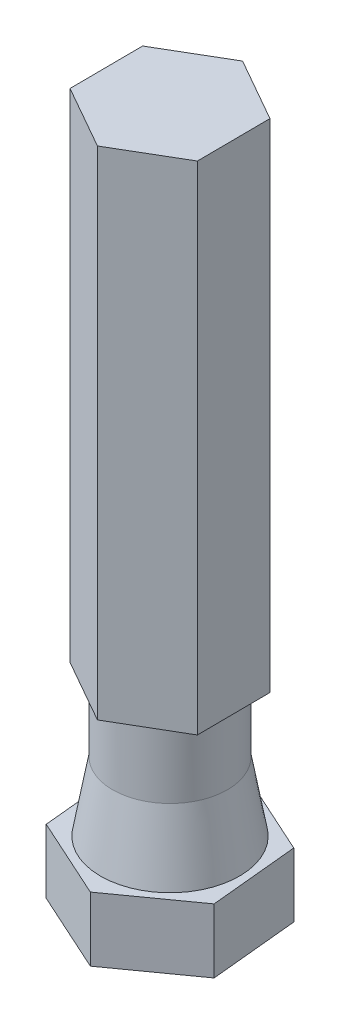
ISO-10303-21;
HEADER;
FILE_DESCRIPTION(('STEP AP214'),'2;1');
FILE_NAME('part.step','',(''),(''),'','','');
FILE_SCHEMA(('AUTOMOTIVE_DESIGN { 1 0 10303 214 1 1 1 1 }'));
ENDSEC;
DATA;
#1=APPLICATION_CONTEXT('core data for automotive mechanical design processes');
#2=APPLICATION_PROTOCOL_DEFINITION('international standard','automotive_design',2000,#1);
#3=PRODUCT_CONTEXT('',#1,'mechanical');
#4=PRODUCT('Part','Part','',(#3));
#5=PRODUCT_RELATED_PRODUCT_CATEGORY('part','',(#4));
#6=PRODUCT_DEFINITION_FORMATION('','',#4);
#7=PRODUCT_DEFINITION_CONTEXT('part definition',#1,'design');
#8=PRODUCT_DEFINITION('design','',#6,#7);
#9=PRODUCT_DEFINITION_SHAPE('','',#8);
#10=(LENGTH_UNIT() NAMED_UNIT(*) SI_UNIT(.MILLI.,.METRE.));
#11=(NAMED_UNIT(*) PLANE_ANGLE_UNIT() SI_UNIT($,.RADIAN.));
#12=(NAMED_UNIT(*) SI_UNIT($,.STERADIAN.) SOLID_ANGLE_UNIT());
#13=UNCERTAINTY_MEASURE_WITH_UNIT(LENGTH_MEASURE(1.E-05),#10,'distance_accuracy_value','');
#14=(GEOMETRIC_REPRESENTATION_CONTEXT(3) GLOBAL_UNCERTAINTY_ASSIGNED_CONTEXT((#13)) GLOBAL_UNIT_ASSIGNED_CONTEXT((#10,
#11,#12)) REPRESENTATION_CONTEXT('',''));
#15=CARTESIAN_POINT('',(0.,0.,0.));
#16=DIRECTION('',(0.,0.,1.));
#17=DIRECTION('',(1.,0.,0.));
#18=AXIS2_PLACEMENT_3D('',#15,#16,#17);
#19=CARTESIAN_POINT('',(0.,7.1,0.));
#20=DIRECTION('',(0.,1.,0.));
#21=DIRECTION('',(0.,0.,1.));
#22=AXIS2_PLACEMENT_3D('',#19,#20,#21);
#23=PLANE('',#22);
#24=CARTESIAN_POINT('',(-25.2821840262169,7.1,2.48253854140442));
#25=DIRECTION('',(0.,1.,0.));
#26=DIRECTION('',(0.,0.,1.));
#27=AXIS2_PLACEMENT_3D('',#24,#25,#26);
#28=CIRCLE('',#27,7.68249430877357);
#29=CARTESIAN_POINT('',(-25.2821840262169,7.1,10.165032850178));
#30=VERTEX_POINT('',#29);
#31=EDGE_CURVE('E12',#30,#30,#28,.T.);
#32=ORIENTED_EDGE('',*,*,#31,.F.);
#33=EDGE_LOOP('',(#32));
#34=FACE_BOUND('',#33,.T.);
#35=DIRECTION('',(-0.0972653293074255,0.,-0.995258486884045));
#36=VECTOR('',#35,1.);
#37=CARTESIAN_POINT('',(-16.3451594932056,7.1,6.53999166247528));
#38=LINE('',#37,#36);
#39=CARTESIAN_POINT('',(-16.3451594932056,7.1,6.53999166247528));
#40=VERTEX_POINT('',#39);
#41=CARTESIAN_POINT('',(-17.2998142821994,7.1,-3.22842517789267));
#42=VERTEX_POINT('',#41);
#43=EDGE_CURVE('E166',#40,#42,#38,.T.);
#44=ORIENTED_EDGE('',*,*,#43,.T.);
#45=DIRECTION('',(-0.910551797627357,0.,-0.413394997354333));
#46=VECTOR('',#45,1.);
#47=CARTESIAN_POINT('',(-17.2998142821994,7.1,-3.22842517789267));
#48=LINE('',#47,#46);
#49=CARTESIAN_POINT('',(-26.2368388152107,7.1,-7.28587829896354));
#50=VERTEX_POINT('',#49);
#51=EDGE_CURVE('E107',#42,#50,#48,.T.);
#52=ORIENTED_EDGE('',*,*,#51,.T.);
#53=DIRECTION('',(-0.813286468319931,0.,0.581863489529712));
#54=VECTOR('',#53,1.);
#55=CARTESIAN_POINT('',(-26.2368388152107,7.1,-7.28587829896354));
#56=LINE('',#55,#54);
#57=CARTESIAN_POINT('',(-34.2192085592282,7.1,-1.57491457966644));
#58=VERTEX_POINT('',#57);
#59=EDGE_CURVE('E123',#50,#58,#56,.T.);
#60=ORIENTED_EDGE('',*,*,#59,.T.);
#61=DIRECTION('',(0.0972653293074255,0.,0.995258486884045));
#62=VECTOR('',#61,1.);
#63=CARTESIAN_POINT('',(-34.2192085592282,7.1,-1.57491457966644));
#64=LINE('',#63,#62);
#65=CARTESIAN_POINT('',(-33.2645537702344,7.1,8.19350226070152));
#66=VERTEX_POINT('',#65);
#67=EDGE_CURVE('E117',#58,#66,#64,.T.);
#68=ORIENTED_EDGE('',*,*,#67,.T.);
#69=DIRECTION('',(0.910551797627357,0.,0.413394997354333));
#70=VECTOR('',#69,1.);
#71=CARTESIAN_POINT('',(-33.2645537702344,7.1,8.19350226070152));
#72=LINE('',#71,#70);
#73=CARTESIAN_POINT('',(-24.3275292372231,7.1,12.2509553817724));
#74=VERTEX_POINT('',#73);
#75=EDGE_CURVE('E120',#66,#74,#72,.T.);
#76=ORIENTED_EDGE('',*,*,#75,.T.);
#77=DIRECTION('',(0.813286468319931,0.,-0.581863489529712));
#78=VECTOR('',#77,1.);
#79=CARTESIAN_POINT('',(-24.3275292372231,7.1,12.2509553817724));
#80=LINE('',#79,#78);
#81=EDGE_CURVE('E71',#74,#40,#80,.T.);
#82=ORIENTED_EDGE('',*,*,#81,.T.);
#83=EDGE_LOOP('',(#44,#52,#60,#68,#76,#82));
#84=FACE_BOUND('',#83,.T.);
#85=ADVANCED_FACE('F45',(#34,#84),#23,.T.);
#86=CARTESIAN_POINT('',(0.,0.,0.));
#87=DIRECTION('',(0.,1.,0.));
#88=DIRECTION('',(0.,0.,1.));
#89=AXIS2_PLACEMENT_3D('',#86,#87,#88);
#90=PLANE('',#89);
#91=DIRECTION('',(-0.0972653293074255,0.,-0.995258486884045));
#92=VECTOR('',#91,1.);
#93=CARTESIAN_POINT('',(-16.3451594932056,0.,6.53999166247528));
#94=LINE('',#93,#92);
#95=CARTESIAN_POINT('',(-16.3451594932056,0.,6.53999166247528));
#96=VERTEX_POINT('',#95);
#97=CARTESIAN_POINT('',(-17.2998142821994,0.,-3.22842517789267));
#98=VERTEX_POINT('',#97);
#99=EDGE_CURVE('E148',#96,#98,#94,.T.);
#100=ORIENTED_EDGE('',*,*,#99,.F.);
#101=DIRECTION('',(0.813286468319931,0.,-0.581863489529712));
#102=VECTOR('',#101,1.);
#103=CARTESIAN_POINT('',(-24.3275292372231,0.,12.2509553817724));
#104=LINE('',#103,#102);
#105=CARTESIAN_POINT('',(-24.3275292372231,0.,12.2509553817724));
#106=VERTEX_POINT('',#105);
#107=EDGE_CURVE('E98',#106,#96,#104,.T.);
#108=ORIENTED_EDGE('',*,*,#107,.F.);
#109=DIRECTION('',(0.910551797627357,0.,0.413394997354333));
#110=VECTOR('',#109,1.);
#111=CARTESIAN_POINT('',(-33.2645537702344,0.,8.19350226070152));
#112=LINE('',#111,#110);
#113=CARTESIAN_POINT('',(-33.2645537702344,0.,8.19350226070152));
#114=VERTEX_POINT('',#113);
#115=EDGE_CURVE('E161',#114,#106,#112,.T.);
#116=ORIENTED_EDGE('',*,*,#115,.F.);
#117=DIRECTION('',(0.0972653293074255,0.,0.995258486884045));
#118=VECTOR('',#117,1.);
#119=CARTESIAN_POINT('',(-34.2192085592282,0.,-1.57491457966644));
#120=LINE('',#119,#118);
#121=CARTESIAN_POINT('',(-34.2192085592282,0.,-1.57491457966644));
#122=VERTEX_POINT('',#121);
#123=EDGE_CURVE('E133',#122,#114,#120,.T.);
#124=ORIENTED_EDGE('',*,*,#123,.F.);
#125=DIRECTION('',(-0.813286468319931,0.,0.581863489529712));
#126=VECTOR('',#125,1.);
#127=CARTESIAN_POINT('',(-26.2368388152107,0.,-7.28587829896354));
#128=LINE('',#127,#126);
#129=CARTESIAN_POINT('',(-26.2368388152107,0.,-7.28587829896354));
#130=VERTEX_POINT('',#129);
#131=EDGE_CURVE('E156',#130,#122,#128,.T.);
#132=ORIENTED_EDGE('',*,*,#131,.F.);
#133=DIRECTION('',(-0.910551797627357,0.,-0.413394997354333));
#134=VECTOR('',#133,1.);
#135=CARTESIAN_POINT('',(-17.2998142821994,0.,-3.22842517789267));
#136=LINE('',#135,#134);
#137=EDGE_CURVE('E152',#98,#130,#136,.T.);
#138=ORIENTED_EDGE('',*,*,#137,.F.);
#139=EDGE_LOOP('',(#100,#108,#116,#124,#132,#138));
#140=FACE_BOUND('',#139,.T.);
#141=DIRECTION('',(0.813286468319931,0.,-0.581863489529712));
#142=VECTOR('',#141,1.);
#143=CARTESIAN_POINT('',(-24.6784504601694,0.,8.66018642173342));
#144=LINE('',#143,#142);
#145=CARTESIAN_POINT('',(-24.6784504601694,0.,8.66018642173342));
#146=VERTEX_POINT('',#145);
#147=CARTESIAN_POINT('',(-19.6303172431931,0.,5.04851387625443));
#148=VERTEX_POINT('',#147);
#149=EDGE_CURVE('E62',#146,#148,#144,.T.);
#150=ORIENTED_EDGE('',*,*,#149,.T.);
#151=DIRECTION('',(-0.0972653293074269,0.,-0.995258486884045));
#152=VECTOR('',#151,1.);
#153=CARTESIAN_POINT('',(-19.6303172431931,0.,5.04851387625443));
#154=LINE('',#153,#152);
#155=CARTESIAN_POINT('',(-20.2340508092406,0.,-1.12913400407457));
#156=VERTEX_POINT('',#155);
#157=EDGE_CURVE('E232',#148,#156,#154,.T.);
#158=ORIENTED_EDGE('',*,*,#157,.T.);
#159=DIRECTION('',(-0.910551797627357,0.,-0.413394997354332));
#160=VECTOR('',#159,1.);
#161=CARTESIAN_POINT('',(-20.2340508092406,0.,-1.12913400407457));
#162=LINE('',#161,#160);
#163=CARTESIAN_POINT('',(-25.8859175922644,0.,-3.69510933892458));
#164=VERTEX_POINT('',#163);
#165=EDGE_CURVE('E228',#156,#164,#162,.T.);
#166=ORIENTED_EDGE('',*,*,#165,.T.);
#167=DIRECTION('',(-0.813286468319931,0.,0.581863489529712));
#168=VECTOR('',#167,1.);
#169=CARTESIAN_POINT('',(-25.8859175922644,0.,-3.69510933892458));
#170=LINE('',#169,#168);
#171=CARTESIAN_POINT('',(-30.9340508092406,0.,-0.0834367934455918));
#172=VERTEX_POINT('',#171);
#173=EDGE_CURVE('E224',#164,#172,#170,.T.);
#174=ORIENTED_EDGE('',*,*,#173,.T.);
#175=DIRECTION('',(0.0972653293074254,0.,0.995258486884045));
#176=VECTOR('',#175,1.);
#177=CARTESIAN_POINT('',(-30.9340508092406,0.,-0.0834367934455918));
#178=LINE('',#177,#176);
#179=CARTESIAN_POINT('',(-30.3303172431932,0.,6.09421108688341));
#180=VERTEX_POINT('',#179);
#181=EDGE_CURVE('E220',#172,#180,#178,.T.);
#182=ORIENTED_EDGE('',*,*,#181,.T.);
#183=DIRECTION('',(0.910551797627357,0.,0.413394997354333));
#184=VECTOR('',#183,1.);
#185=CARTESIAN_POINT('',(-30.3303172431932,0.,6.09421108688341));
#186=LINE('',#185,#184);
#187=EDGE_CURVE('E215',#180,#146,#186,.T.);
#188=ORIENTED_EDGE('',*,*,#187,.T.);
#189=EDGE_LOOP('',(#150,#158,#166,#174,#182,#188));
#190=FACE_BOUND('',#189,.T.);
#191=ADVANCED_FACE('F184',(#140,#190),#90,.F.);
#192=CARTESIAN_POINT('',(-16.3451594932056,7.1,6.53999166247528));
#193=DIRECTION('',(-0.995258486884045,0.,0.0972653293074255));
#194=DIRECTION('',(0.0972653293074255,0.,0.995258486884045));
#195=AXIS2_PLACEMENT_3D('',#192,#193,#194);
#196=PLANE('',#195);
#197=ORIENTED_EDGE('',*,*,#99,.T.);
#198=DIRECTION('',(0.,-1.,0.));
#199=VECTOR('',#198,1.);
#200=CARTESIAN_POINT('',(-17.2998142821994,7.1,-3.22842517789267));
#201=LINE('',#200,#199);
#202=EDGE_CURVE('E49',#42,#98,#201,.T.);
#203=ORIENTED_EDGE('',*,*,#202,.F.);
#204=ORIENTED_EDGE('',*,*,#43,.F.);
#205=DIRECTION('',(0.,-1.,0.));
#206=VECTOR('',#205,1.);
#207=CARTESIAN_POINT('',(-16.3451594932056,7.1,6.53999166247528));
#208=LINE('',#207,#206);
#209=EDGE_CURVE('E144',#40,#96,#208,.T.);
#210=ORIENTED_EDGE('',*,*,#209,.T.);
#211=EDGE_LOOP('',(#197,#203,#204,#210));
#212=FACE_BOUND('',#211,.T.);
#213=ADVANCED_FACE('F47',(#212),#196,.F.);
#214=CARTESIAN_POINT('',(-17.2998142821994,7.1,-3.22842517789267));
#215=DIRECTION('',(-0.413394997354333,0.,0.910551797627357));
#216=DIRECTION('',(0.910551797627357,0.,0.413394997354333));
#217=AXIS2_PLACEMENT_3D('',#214,#215,#216);
#218=PLANE('',#217);
#219=ORIENTED_EDGE('',*,*,#137,.T.);
#220=DIRECTION('',(0.,-1.,0.));
#221=VECTOR('',#220,1.);
#222=CARTESIAN_POINT('',(-26.2368388152107,7.1,-7.28587829896354));
#223=LINE('',#222,#221);
#224=EDGE_CURVE('E172',#50,#130,#223,.T.);
#225=ORIENTED_EDGE('',*,*,#224,.F.);
#226=ORIENTED_EDGE('',*,*,#51,.F.);
#227=ORIENTED_EDGE('',*,*,#202,.T.);
#228=EDGE_LOOP('',(#219,#225,#226,#227));
#229=FACE_BOUND('',#228,.T.);
#230=ADVANCED_FACE('F179',(#229),#218,.F.);
#231=CARTESIAN_POINT('',(-26.2368388152107,7.1,-7.28587829896354));
#232=DIRECTION('',(0.581863489529712,0.,0.813286468319931));
#233=DIRECTION('',(0.813286468319931,0.,-0.581863489529712));
#234=AXIS2_PLACEMENT_3D('',#231,#232,#233);
#235=PLANE('',#234);
#236=ORIENTED_EDGE('',*,*,#131,.T.);
#237=DIRECTION('',(0.,-1.,0.));
#238=VECTOR('',#237,1.);
#239=CARTESIAN_POINT('',(-34.2192085592282,7.1,-1.57491457966644));
#240=LINE('',#239,#238);
#241=EDGE_CURVE('E137',#58,#122,#240,.T.);
#242=ORIENTED_EDGE('',*,*,#241,.F.);
#243=ORIENTED_EDGE('',*,*,#59,.F.);
#244=ORIENTED_EDGE('',*,*,#224,.T.);
#245=EDGE_LOOP('',(#236,#242,#243,#244));
#246=FACE_BOUND('',#245,.T.);
#247=ADVANCED_FACE('F186',(#246),#235,.F.);
#248=CARTESIAN_POINT('',(-34.2192085592282,7.1,-1.57491457966644));
#249=DIRECTION('',(0.995258486884045,0.,-0.0972653293074255));
#250=DIRECTION('',(-0.0972653293074255,0.,-0.995258486884045));
#251=AXIS2_PLACEMENT_3D('',#248,#249,#250);
#252=PLANE('',#251);
#253=ORIENTED_EDGE('',*,*,#123,.T.);
#254=DIRECTION('',(0.,-1.,0.));
#255=VECTOR('',#254,1.);
#256=CARTESIAN_POINT('',(-33.2645537702344,7.1,8.19350226070152));
#257=LINE('',#256,#255);
#258=EDGE_CURVE('E130',#66,#114,#257,.T.);
#259=ORIENTED_EDGE('',*,*,#258,.F.);
#260=ORIENTED_EDGE('',*,*,#67,.F.);
#261=ORIENTED_EDGE('',*,*,#241,.T.);
#262=EDGE_LOOP('',(#253,#259,#260,#261));
#263=FACE_BOUND('',#262,.T.);
#264=ADVANCED_FACE('F131',(#263),#252,.F.);
#265=CARTESIAN_POINT('',(-33.2645537702344,7.1,8.19350226070152));
#266=DIRECTION('',(0.413394997354333,0.,-0.910551797627357));
#267=DIRECTION('',(-0.910551797627357,0.,-0.413394997354333));
#268=AXIS2_PLACEMENT_3D('',#265,#266,#267);
#269=PLANE('',#268);
#270=ORIENTED_EDGE('',*,*,#115,.T.);
#271=DIRECTION('',(0.,-1.,0.));
#272=VECTOR('',#271,1.);
#273=CARTESIAN_POINT('',(-24.3275292372231,7.1,12.2509553817724));
#274=LINE('',#273,#272);
#275=EDGE_CURVE('E138',#74,#106,#274,.T.);
#276=ORIENTED_EDGE('',*,*,#275,.F.);
#277=ORIENTED_EDGE('',*,*,#75,.F.);
#278=ORIENTED_EDGE('',*,*,#258,.T.);
#279=EDGE_LOOP('',(#270,#276,#277,#278));
#280=FACE_BOUND('',#279,.T.);
#281=ADVANCED_FACE('F140',(#280),#269,.F.);
#282=CARTESIAN_POINT('',(-24.3275292372231,7.1,12.2509553817724));
#283=DIRECTION('',(-0.581863489529712,0.,-0.813286468319931));
#284=DIRECTION('',(-0.813286468319931,0.,0.581863489529712));
#285=AXIS2_PLACEMENT_3D('',#282,#283,#284);
#286=PLANE('',#285);
#287=ORIENTED_EDGE('',*,*,#107,.T.);
#288=ORIENTED_EDGE('',*,*,#209,.F.);
#289=ORIENTED_EDGE('',*,*,#81,.F.);
#290=ORIENTED_EDGE('',*,*,#275,.T.);
#291=EDGE_LOOP('',(#287,#288,#289,#290));
#292=FACE_BOUND('',#291,.T.);
#293=ADVANCED_FACE('F430',(#292),#286,.F.);
#294=CARTESIAN_POINT('',(-24.6784504601694,7.1,8.66018642173342));
#295=DIRECTION('',(-0.581863489529712,0.,-0.813286468319931));
#296=DIRECTION('',(-0.813286468319931,0.,0.581863489529712));
#297=AXIS2_PLACEMENT_3D('',#294,#295,#296);
#298=PLANE('',#297);
#299=ORIENTED_EDGE('',*,*,#149,.F.);
#300=DIRECTION('',(0.,-1.,0.));
#301=VECTOR('',#300,1.);
#302=CARTESIAN_POINT('',(-24.6784504601694,7.1,8.66018642173342));
#303=LINE('',#302,#301);
#304=CARTESIAN_POINT('',(-24.6784504601694,7.1,8.66018642173342));
#305=VERTEX_POINT('',#304);
#306=EDGE_CURVE('E211',#305,#146,#303,.T.);
#307=ORIENTED_EDGE('',*,*,#306,.F.);
#308=DIRECTION('',(0.813286468319931,0.,-0.581863489529712));
#309=VECTOR('',#308,1.);
#310=CARTESIAN_POINT('',(-24.6784504601694,7.1,8.66018642173342));
#311=LINE('',#310,#309);
#312=CARTESIAN_POINT('',(-19.6303172431931,7.1,5.04851387625443));
#313=VERTEX_POINT('',#312);
#314=EDGE_CURVE('E219',#305,#313,#311,.T.);
#315=ORIENTED_EDGE('',*,*,#314,.T.);
#316=DIRECTION('',(0.,-1.,0.));
#317=VECTOR('',#316,1.);
#318=CARTESIAN_POINT('',(-19.6303172431931,7.1,5.04851387625443));
#319=LINE('',#318,#317);
#320=EDGE_CURVE('E153',#313,#148,#319,.T.);
#321=ORIENTED_EDGE('',*,*,#320,.T.);
#322=EDGE_LOOP('',(#299,#307,#315,#321));
#323=FACE_BOUND('',#322,.T.);
#324=ADVANCED_FACE('F428',(#323),#298,.T.);
#325=CARTESIAN_POINT('',(-19.6303172431931,7.1,5.04851387625443));
#326=DIRECTION('',(-0.995258486884045,0.,0.097265329307427));
#327=DIRECTION('',(0.097265329307427,0.,0.995258486884045));
#328=AXIS2_PLACEMENT_3D('',#325,#326,#327);
#329=PLANE('',#328);
#330=ORIENTED_EDGE('',*,*,#157,.F.);
#331=ORIENTED_EDGE('',*,*,#320,.F.);
#332=DIRECTION('',(-0.0972653293074269,0.,-0.995258486884045));
#333=VECTOR('',#332,1.);
#334=CARTESIAN_POINT('',(-19.6303172431931,7.1,5.04851387625443));
#335=LINE('',#334,#333);
#336=CARTESIAN_POINT('',(-20.2340508092406,7.1,-1.12913400407457));
#337=VERTEX_POINT('',#336);
#338=EDGE_CURVE('E254',#313,#337,#335,.T.);
#339=ORIENTED_EDGE('',*,*,#338,.T.);
#340=DIRECTION('',(0.,-1.,0.));
#341=VECTOR('',#340,1.);
#342=CARTESIAN_POINT('',(-20.2340508092406,7.1,-1.12913400407457));
#343=LINE('',#342,#341);
#344=EDGE_CURVE('E195',#337,#156,#343,.T.);
#345=ORIENTED_EDGE('',*,*,#344,.T.);
#346=EDGE_LOOP('',(#330,#331,#339,#345));
#347=FACE_BOUND('',#346,.T.);
#348=ADVANCED_FACE('F427',(#347),#329,.T.);
#349=CARTESIAN_POINT('',(-20.2340508092406,7.1,-1.12913400407457));
#350=DIRECTION('',(-0.413394997354332,0.,0.910551797627357));
#351=DIRECTION('',(0.910551797627357,0.,0.413394997354333));
#352=AXIS2_PLACEMENT_3D('',#349,#350,#351);
#353=PLANE('',#352);
#354=ORIENTED_EDGE('',*,*,#165,.F.);
#355=ORIENTED_EDGE('',*,*,#344,.F.);
#356=DIRECTION('',(-0.910551797627357,0.,-0.413394997354332));
#357=VECTOR('',#356,1.);
#358=CARTESIAN_POINT('',(-20.2340508092406,7.1,-1.12913400407457));
#359=LINE('',#358,#357);
#360=CARTESIAN_POINT('',(-25.8859175922644,7.1,-3.69510933892458));
#361=VERTEX_POINT('',#360);
#362=EDGE_CURVE('E250',#337,#361,#359,.T.);
#363=ORIENTED_EDGE('',*,*,#362,.T.);
#364=DIRECTION('',(0.,-1.,0.));
#365=VECTOR('',#364,1.);
#366=CARTESIAN_POINT('',(-25.8859175922644,7.1,-3.69510933892458));
#367=LINE('',#366,#365);
#368=EDGE_CURVE('E199',#361,#164,#367,.T.);
#369=ORIENTED_EDGE('',*,*,#368,.T.);
#370=EDGE_LOOP('',(#354,#355,#363,#369));
#371=FACE_BOUND('',#370,.T.);
#372=ADVANCED_FACE('F420',(#371),#353,.T.);
#373=CARTESIAN_POINT('',(-25.8859175922644,7.1,-3.69510933892458));
#374=DIRECTION('',(0.581863489529712,0.,0.813286468319931));
#375=DIRECTION('',(0.813286468319931,0.,-0.581863489529712));
#376=AXIS2_PLACEMENT_3D('',#373,#374,#375);
#377=PLANE('',#376);
#378=ORIENTED_EDGE('',*,*,#173,.F.);
#379=ORIENTED_EDGE('',*,*,#368,.F.);
#380=DIRECTION('',(-0.813286468319931,0.,0.581863489529712));
#381=VECTOR('',#380,1.);
#382=CARTESIAN_POINT('',(-25.8859175922644,7.1,-3.69510933892458));
#383=LINE('',#382,#381);
#384=CARTESIAN_POINT('',(-30.9340508092406,7.1,-0.0834367934455918));
#385=VERTEX_POINT('',#384);
#386=EDGE_CURVE('E246',#361,#385,#383,.T.);
#387=ORIENTED_EDGE('',*,*,#386,.T.);
#388=DIRECTION('',(0.,-1.,0.));
#389=VECTOR('',#388,1.);
#390=CARTESIAN_POINT('',(-30.9340508092406,7.1,-0.0834367934455918));
#391=LINE('',#390,#389);
#392=EDGE_CURVE('E203',#385,#172,#391,.T.);
#393=ORIENTED_EDGE('',*,*,#392,.T.);
#394=EDGE_LOOP('',(#378,#379,#387,#393));
#395=FACE_BOUND('',#394,.T.);
#396=ADVANCED_FACE('F418',(#395),#377,.T.);
#397=CARTESIAN_POINT('',(-30.9340508092406,7.1,-0.0834367934455918));
#398=DIRECTION('',(0.995258486884045,0.,-0.0972653293074254));
#399=DIRECTION('',(-0.0972653293074254,0.,-0.995258486884045));
#400=AXIS2_PLACEMENT_3D('',#397,#398,#399);
#401=PLANE('',#400);
#402=ORIENTED_EDGE('',*,*,#181,.F.);
#403=ORIENTED_EDGE('',*,*,#392,.F.);
#404=DIRECTION('',(0.0972653293074254,0.,0.995258486884045));
#405=VECTOR('',#404,1.);
#406=CARTESIAN_POINT('',(-30.9340508092406,7.1,-0.0834367934455918));
#407=LINE('',#406,#405);
#408=CARTESIAN_POINT('',(-30.3303172431932,7.1,6.0942110868834));
#409=VERTEX_POINT('',#408);
#410=EDGE_CURVE('E242',#385,#409,#407,.T.);
#411=ORIENTED_EDGE('',*,*,#410,.T.);
#412=DIRECTION('',(0.,-1.,0.));
#413=VECTOR('',#412,1.);
#414=CARTESIAN_POINT('',(-30.3303172431932,7.1,6.09421108688341));
#415=LINE('',#414,#413);
#416=EDGE_CURVE('E207',#409,#180,#415,.T.);
#417=ORIENTED_EDGE('',*,*,#416,.T.);
#418=EDGE_LOOP('',(#402,#403,#411,#417));
#419=FACE_BOUND('',#418,.T.);
#420=ADVANCED_FACE('F413',(#419),#401,.T.);
#421=CARTESIAN_POINT('',(-30.3303172431932,7.1,6.09421108688341));
#422=DIRECTION('',(0.413394997354333,0.,-0.910551797627357));
#423=DIRECTION('',(-0.910551797627357,0.,-0.413394997354333));
#424=AXIS2_PLACEMENT_3D('',#421,#422,#423);
#425=PLANE('',#424);
#426=ORIENTED_EDGE('',*,*,#187,.F.);
#427=ORIENTED_EDGE('',*,*,#416,.F.);
#428=DIRECTION('',(0.910551797627357,0.,0.413394997354333));
#429=VECTOR('',#428,1.);
#430=CARTESIAN_POINT('',(-30.3303172431932,7.1,6.09421108688341));
#431=LINE('',#430,#429);
#432=EDGE_CURVE('E214',#409,#305,#431,.T.);
#433=ORIENTED_EDGE('',*,*,#432,.T.);
#434=ORIENTED_EDGE('',*,*,#306,.T.);
#435=EDGE_LOOP('',(#426,#427,#433,#434));
#436=FACE_BOUND('',#435,.T.);
#437=ADVANCED_FACE('F415',(#436),#425,.T.);
#438=CARTESIAN_POINT('',(-25.2821840262169,7.1,2.48253854140442));
#439=DIRECTION('',(0.,1.,0.));
#440=DIRECTION('',(0.,0.,1.));
#441=AXIS2_PLACEMENT_3D('',#438,#439,#440);
#442=PLANE('',#441);
#443=ORIENTED_EDGE('',*,*,#338,.F.);
#444=ORIENTED_EDGE('',*,*,#314,.F.);
#445=ORIENTED_EDGE('',*,*,#432,.F.);
#446=ORIENTED_EDGE('',*,*,#410,.F.);
#447=ORIENTED_EDGE('',*,*,#386,.F.);
#448=ORIENTED_EDGE('',*,*,#362,.F.);
#449=EDGE_LOOP('',(#443,#444,#445,#446,#447,#448));
#450=FACE_BOUND('',#449,.T.);
#451=CARTESIAN_POINT('',(-25.2821840262169,7.1,2.48253854140442));
#452=DIRECTION('',(0.,1.,0.));
#453=DIRECTION('',(0.,0.,1.));
#454=AXIS2_PLACEMENT_3D('',#451,#452,#453);
#455=CIRCLE('',#454,1.75);
#456=CARTESIAN_POINT('',(-25.2821840262169,7.1,4.23253854140442));
#457=VERTEX_POINT('',#456);
#458=EDGE_CURVE('E265',#457,#457,#455,.T.);
#459=ORIENTED_EDGE('',*,*,#458,.T.);
#460=EDGE_LOOP('',(#459));
#461=FACE_BOUND('',#460,.T.);
#462=ADVANCED_FACE('F423',(#450,#461),#442,.F.);
#463=CARTESIAN_POINT('',(-25.2821840262169,7.1,2.48253854140442));
#464=DIRECTION('',(0.,-1.,0.));
#465=DIRECTION('',(0.,0.,1.));
#466=AXIS2_PLACEMENT_3D('',#463,#464,#465);
#467=CONICAL_SURFACE('',#466,7.68249430877357,0.174532925199433);
#468=CARTESIAN_POINT('',(-25.2821840262169,14.7,2.48253854140442));
#469=DIRECTION('',(0.,1.,0.));
#470=DIRECTION('',(0.,0.,1.));
#471=AXIS2_PLACEMENT_3D('',#468,#469,#470);
#472=CIRCLE('',#471,6.34240925538924);
#473=CARTESIAN_POINT('',(-25.2821840262169,14.7,-3.85987071398482));
#474=VERTEX_POINT('',#473);
#475=EDGE_CURVE('E238',#474,#474,#472,.T.);
#476=ORIENTED_EDGE('',*,*,#475,.F.);
#477=EDGE_LOOP('',(#476));
#478=FACE_BOUND('',#477,.T.);
#479=ORIENTED_EDGE('',*,*,#31,.T.);
#480=EDGE_LOOP('',(#479));
#481=FACE_BOUND('',#480,.T.);
#482=ADVANCED_FACE('F538',(#478,#481),#467,.T.);
#483=CARTESIAN_POINT('',(-25.2821840262169,7.1,2.48253854140442));
#484=DIRECTION('',(0.,1.,0.));
#485=DIRECTION('',(0.,0.,1.));
#486=AXIS2_PLACEMENT_3D('',#483,#484,#485);
#487=CONICAL_SURFACE('',#486,1.75,0.174532925199433);
#488=CARTESIAN_POINT('',(-25.2821840262169,14.7,2.48253854140442));
#489=DIRECTION('',(0.,1.,0.));
#490=DIRECTION('',(0.,0.,1.));
#491=AXIS2_PLACEMENT_3D('',#488,#489,#490);
#492=CIRCLE('',#491,3.09008505338434);
#493=CARTESIAN_POINT('',(-25.2821840262169,14.7,5.57262359478876));
#494=VERTEX_POINT('',#493);
#495=EDGE_CURVE('E261',#494,#494,#492,.T.);
#496=ORIENTED_EDGE('',*,*,#495,.T.);
#497=EDGE_LOOP('',(#496));
#498=FACE_BOUND('',#497,.T.);
#499=ORIENTED_EDGE('',*,*,#458,.F.);
#500=EDGE_LOOP('',(#499));
#501=FACE_BOUND('',#500,.T.);
#502=ADVANCED_FACE('F546',(#498,#501),#487,.F.);
#503=CARTESIAN_POINT('',(-25.2821840262169,14.7,2.48253854140442));
#504=DIRECTION('',(0.,1.,0.));
#505=DIRECTION('',(0.,0.,1.));
#506=AXIS2_PLACEMENT_3D('',#503,#504,#505);
#507=PLANE('',#506);
#508=ORIENTED_EDGE('',*,*,#495,.F.);
#509=EDGE_LOOP('',(#508));
#510=FACE_BOUND('',#509,.T.);
#511=ADVANCED_FACE('F555',(#510),#507,.F.);
#512=CARTESIAN_POINT('',(-25.2821840262169,22.3,2.48253854140442));
#513=DIRECTION('',(0.,-1.,0.));
#514=DIRECTION('',(0.,0.,-1.));
#515=AXIS2_PLACEMENT_3D('',#512,#513,#514);
#516=CYLINDRICAL_SURFACE('',#515,6.34240925538924);
#517=CARTESIAN_POINT('',(-25.2821840262169,22.3,2.48253854140442));
#518=DIRECTION('',(0.,1.,0.));
#519=DIRECTION('',(0.,0.,1.));
#520=AXIS2_PLACEMENT_3D('',#517,#518,#519);
#521=CIRCLE('',#520,6.34240925538924);
#522=CARTESIAN_POINT('',(-25.2821840262169,22.3,-3.85987071398482));
#523=VERTEX_POINT('',#522);
#524=EDGE_CURVE('E266',#523,#523,#521,.T.);
#525=CARTESIAN_POINT('',(-25.2821840262169,22.3,-3.85987071398482));
#526=CARTESIAN_POINT('',(-25.2821840262169,22.2208333333333,-3.85987071398482));
#527=CARTESIAN_POINT('',(-25.2821840262169,22.1416666666667,-3.85987071398482));
#528=CARTESIAN_POINT('',(-25.2821840262169,21.9833333333333,-3.85987071398482));
#529=CARTESIAN_POINT('',(-25.2821840262169,21.9041666666667,-3.85987071398482));
#530=CARTESIAN_POINT('',(-25.2821840262169,21.7458333333333,-3.85987071398482));
#531=CARTESIAN_POINT('',(-25.2821840262169,21.6666666666667,-3.85987071398482));
#532=CARTESIAN_POINT('',(-25.2821840262169,21.5083333333333,-3.85987071398482));
#533=CARTESIAN_POINT('',(-25.2821840262169,21.4291666666667,-3.85987071398482));
#534=CARTESIAN_POINT('',(-25.2821840262169,21.2708333333333,-3.85987071398482));
#535=CARTESIAN_POINT('',(-25.2821840262169,21.1916666666667,-3.85987071398482));
#536=CARTESIAN_POINT('',(-25.2821840262169,21.0333333333333,-3.85987071398482));
#537=CARTESIAN_POINT('',(-25.2821840262169,20.9541666666667,-3.85987071398482));
#538=CARTESIAN_POINT('',(-25.2821840262169,20.7958333333333,-3.85987071398482));
#539=CARTESIAN_POINT('',(-25.2821840262169,20.7166666666667,-3.85987071398482));
#540=CARTESIAN_POINT('',(-25.2821840262169,20.5583333333333,-3.85987071398482));
#541=CARTESIAN_POINT('',(-25.2821840262169,20.4791666666667,-3.85987071398482));
#542=CARTESIAN_POINT('',(-25.2821840262169,20.3208333333333,-3.85987071398482));
#543=CARTESIAN_POINT('',(-25.2821840262169,20.2416666666667,-3.85987071398482));
#544=CARTESIAN_POINT('',(-25.2821840262169,20.0833333333333,-3.85987071398482));
#545=CARTESIAN_POINT('',(-25.2821840262169,20.0041666666667,-3.85987071398482));
#546=CARTESIAN_POINT('',(-25.2821840262169,19.8458333333333,-3.85987071398482));
#547=CARTESIAN_POINT('',(-25.2821840262169,19.7666666666667,-3.85987071398482));
#548=CARTESIAN_POINT('',(-25.2821840262169,19.6083333333333,-3.85987071398482));
#549=CARTESIAN_POINT('',(-25.2821840262169,19.5291666666667,-3.85987071398482));
#550=CARTESIAN_POINT('',(-25.2821840262169,19.3708333333333,-3.85987071398482));
#551=CARTESIAN_POINT('',(-25.2821840262169,19.2916666666667,-3.85987071398482));
#552=CARTESIAN_POINT('',(-25.2821840262169,19.1333333333333,-3.85987071398482));
#553=CARTESIAN_POINT('',(-25.2821840262169,19.0541666666667,-3.85987071398482));
#554=CARTESIAN_POINT('',(-25.2821840262169,18.8958333333333,-3.85987071398482));
#555=CARTESIAN_POINT('',(-25.2821840262169,18.8166666666667,-3.85987071398482));
#556=CARTESIAN_POINT('',(-25.2821840262169,18.6583333333333,-3.85987071398482));
#557=CARTESIAN_POINT('',(-25.2821840262169,18.5791666666667,-3.85987071398482));
#558=CARTESIAN_POINT('',(-25.2821840262169,18.4208333333333,-3.85987071398482));
#559=CARTESIAN_POINT('',(-25.2821840262169,18.3416666666667,-3.85987071398482));
#560=CARTESIAN_POINT('',(-25.2821840262169,18.1833333333333,-3.85987071398482));
#561=CARTESIAN_POINT('',(-25.2821840262169,18.1041666666667,-3.85987071398482));
#562=CARTESIAN_POINT('',(-25.2821840262169,17.9458333333333,-3.85987071398482));
#563=CARTESIAN_POINT('',(-25.2821840262169,17.8666666666667,-3.85987071398482));
#564=CARTESIAN_POINT('',(-25.2821840262169,17.7083333333333,-3.85987071398482));
#565=CARTESIAN_POINT('',(-25.2821840262169,17.6291666666667,-3.85987071398482));
#566=CARTESIAN_POINT('',(-25.2821840262169,17.4708333333333,-3.85987071398482));
#567=CARTESIAN_POINT('',(-25.2821840262169,17.3916666666667,-3.85987071398482));
#568=CARTESIAN_POINT('',(-25.2821840262169,17.2333333333333,-3.85987071398482));
#569=CARTESIAN_POINT('',(-25.2821840262169,17.1541666666667,-3.85987071398482));
#570=CARTESIAN_POINT('',(-25.2821840262169,16.9958333333333,-3.85987071398482));
#571=CARTESIAN_POINT('',(-25.2821840262169,16.9166666666667,-3.85987071398482));
#572=CARTESIAN_POINT('',(-25.2821840262169,16.7583333333333,-3.85987071398482));
#573=CARTESIAN_POINT('',(-25.2821840262169,16.6791666666667,-3.85987071398482));
#574=CARTESIAN_POINT('',(-25.2821840262169,16.5208333333333,-3.85987071398482));
#575=CARTESIAN_POINT('',(-25.2821840262169,16.4416666666667,-3.85987071398482));
#576=CARTESIAN_POINT('',(-25.2821840262169,16.2833333333333,-3.85987071398482));
#577=CARTESIAN_POINT('',(-25.2821840262169,16.2041666666667,-3.85987071398482));
#578=CARTESIAN_POINT('',(-25.2821840262169,16.0458333333333,-3.85987071398482));
#579=CARTESIAN_POINT('',(-25.2821840262169,15.9666666666667,-3.85987071398482));
#580=CARTESIAN_POINT('',(-25.2821840262169,15.8083333333333,-3.85987071398482));
#581=CARTESIAN_POINT('',(-25.2821840262169,15.7291666666667,-3.85987071398482));
#582=CARTESIAN_POINT('',(-25.2821840262169,15.5708333333333,-3.85987071398482));
#583=CARTESIAN_POINT('',(-25.2821840262169,15.4916666666667,-3.85987071398482));
#584=CARTESIAN_POINT('',(-25.2821840262169,15.3333333333333,-3.85987071398482));
#585=CARTESIAN_POINT('',(-25.2821840262169,15.2541666666667,-3.85987071398482));
#586=CARTESIAN_POINT('',(-25.2821840262169,15.0958333333333,-3.85987071398482));
#587=CARTESIAN_POINT('',(-25.2821840262169,15.0166666666667,-3.85987071398482));
#588=CARTESIAN_POINT('',(-25.2821840262169,14.8583333333333,-3.85987071398482));
#589=CARTESIAN_POINT('',(-25.2821840262169,14.7791666666667,-3.85987071398482));
#590=CARTESIAN_POINT('',(-25.2821840262169,14.7,-3.85987071398482));
#591=B_SPLINE_CURVE_WITH_KNOTS('',3,(#525,#526,#527,#528,#529,#530,#531,#532,#533,#534,#535,
#536,#537,#538,#539,#540,#541,#542,#543,#544,#545,#546,#547,#548,#549,#550,#551,#552,#553,#554,
#555,#556,#557,#558,#559,#560,#561,#562,#563,#564,#565,#566,#567,#568,#569,#570,#571,#572,#573,
#574,#575,#576,#577,#578,#579,#580,#581,#582,#583,#584,#585,#586,#587,#588,#589,#590),
.UNSPECIFIED.,.F.,.F.,(4,2,2,2,2,2,2,2,2,2,2,2,2,2,2,2,2,2,2,2,2,2,2,2,2,2,2,2,2,2,2,2,4),(0.,
0.237499999999998,0.475,0.712499999999998,0.95,1.1875,1.425,1.6625,1.9,2.1375,2.375,2.6125,2.85,
3.0875,3.325,3.5625,3.8,4.0375,4.275,4.5125,4.75,4.9875,5.225,5.4625,5.7,5.9375,6.175,6.4125,
6.65,6.8875,7.125,7.3625,7.6),.UNSPECIFIED.);
#592=EDGE_CURVE('BSEAM564',#523,#474,#591,.T.);
#593=ORIENTED_EDGE('',*,*,#524,.F.);
#594=ORIENTED_EDGE('',*,*,#475,.T.);
#595=ORIENTED_EDGE('',*,*,#592,.T.);
#596=ORIENTED_EDGE('',*,*,#592,.F.);
#597=EDGE_LOOP('',(#593,#595,#594,#596));
#598=FACE_BOUND('',#597,.T.);
#599=ADVANCED_FACE('F564',(#598),#516,.T.);
#600=CARTESIAN_POINT('',(-25.2282960003853,77.3,10.5654423100592));
#601=DIRECTION('',(-0.505762477177515,0.,-0.862672774972795));
#602=DIRECTION('',(-0.862672774972795,0.,0.505762477177515));
#603=AXIS2_PLACEMENT_3D('',#600,#601,#602);
#604=PLANE('',#603);
#605=DIRECTION('',(0.862672774972795,0.,-0.505762477177515));
#606=VECTOR('',#605,1.);
#607=CARTESIAN_POINT('',(-25.2282960003853,22.3,10.5654423100592));
#608=LINE('',#607,#606);
#609=CARTESIAN_POINT('',(-25.2282960003853,22.3,10.5654423100592));
#610=VERTEX_POINT('',#609);
#611=CARTESIAN_POINT('',(-18.2552400133011,22.3,6.47732202640187));
#612=VERTEX_POINT('',#611);
#613=EDGE_CURVE('E322',#610,#612,#608,.T.);
#614=ORIENTED_EDGE('',*,*,#613,.T.);
#615=DIRECTION('',(0.,-1.,0.));
#616=VECTOR('',#615,1.);
#617=CARTESIAN_POINT('',(-18.2552400133011,77.3,6.47732202640187));
#618=LINE('',#617,#616);
#619=CARTESIAN_POINT('',(-18.2552400133011,77.3,6.47732202640187));
#620=VERTEX_POINT('',#619);
#621=EDGE_CURVE('E276',#620,#612,#618,.T.);
#622=ORIENTED_EDGE('',*,*,#621,.F.);
#623=DIRECTION('',(0.862672774972795,0.,-0.505762477177515));
#624=VECTOR('',#623,1.);
#625=CARTESIAN_POINT('',(-25.2282960003853,77.3,10.5654423100592));
#626=LINE('',#625,#624);
#627=CARTESIAN_POINT('',(-25.2282960003853,77.3,10.5654423100592));
#628=VERTEX_POINT('',#627);
#629=EDGE_CURVE('E305',#628,#620,#626,.T.);
#630=ORIENTED_EDGE('',*,*,#629,.F.);
#631=DIRECTION('',(0.,-1.,0.));
#632=VECTOR('',#631,1.);
#633=CARTESIAN_POINT('',(-25.2282960003853,77.3,10.5654423100592));
#634=LINE('',#633,#632);
#635=EDGE_CURVE('E296',#628,#610,#634,.T.);
#636=ORIENTED_EDGE('',*,*,#635,.T.);
#637=EDGE_LOOP('',(#614,#622,#630,#636));
#638=FACE_BOUND('',#637,.T.);
#639=ADVANCED_FACE('F361',(#638),#604,.F.);
#640=CARTESIAN_POINT('',(-18.2552400133011,77.3,6.47732202640187));
#641=DIRECTION('',(-0.999977776868415,0.,0.00666676603027826));
#642=DIRECTION('',(0.00666676603027826,0.,0.999977776868415));
#643=AXIS2_PLACEMENT_3D('',#640,#641,#642);
#644=PLANE('',#643);
#645=DIRECTION('',(-0.00666676603027826,0.,-0.999977776868415));
#646=VECTOR('',#645,1.);
#647=CARTESIAN_POINT('',(-18.2552400133011,22.3,6.47732202640187));
#648=LINE('',#647,#646);
#649=CARTESIAN_POINT('',(-18.3091280391327,22.3,-1.60558174225288));
#650=VERTEX_POINT('',#649);
#651=EDGE_CURVE('E318',#612,#650,#648,.T.);
#652=ORIENTED_EDGE('',*,*,#651,.T.);
#653=DIRECTION('',(0.,-1.,0.));
#654=VECTOR('',#653,1.);
#655=CARTESIAN_POINT('',(-18.3091280391327,77.3,-1.60558174225288));
#656=LINE('',#655,#654);
#657=CARTESIAN_POINT('',(-18.3091280391327,77.3,-1.60558174225288));
#658=VERTEX_POINT('',#657);
#659=EDGE_CURVE('E280',#658,#650,#656,.T.);
#660=ORIENTED_EDGE('',*,*,#659,.F.);
#661=DIRECTION('',(-0.00666676603027826,0.,-0.999977776868415));
#662=VECTOR('',#661,1.);
#663=CARTESIAN_POINT('',(-18.2552400133011,77.3,6.47732202640187));
#664=LINE('',#663,#662);
#665=EDGE_CURVE('E341',#620,#658,#664,.T.);
#666=ORIENTED_EDGE('',*,*,#665,.F.);
#667=ORIENTED_EDGE('',*,*,#621,.T.);
#668=EDGE_LOOP('',(#652,#660,#666,#667));
#669=FACE_BOUND('',#668,.T.);
#670=ADVANCED_FACE('F365',(#669),#644,.F.);
#671=CARTESIAN_POINT('',(-18.3091280391327,77.3,-1.60558174225288));
#672=DIRECTION('',(-0.4942152996909,0.,0.869339541003073));
#673=DIRECTION('',(0.869339541003073,0.,0.4942152996909));
#674=AXIS2_PLACEMENT_3D('',#671,#672,#673);
#675=PLANE('',#674);
#676=DIRECTION('',(-0.869339541003073,0.,-0.4942152996909));
#677=VECTOR('',#676,1.);
#678=CARTESIAN_POINT('',(-18.3091280391327,22.3,-1.60558174225288));
#679=LINE('',#678,#677);
#680=CARTESIAN_POINT('',(-25.3360720520485,22.3,-5.60036522725033));
#681=VERTEX_POINT('',#680);
#682=EDGE_CURVE('E314',#650,#681,#679,.T.);
#683=ORIENTED_EDGE('',*,*,#682,.T.);
#684=DIRECTION('',(0.,-1.,0.));
#685=VECTOR('',#684,1.);
#686=CARTESIAN_POINT('',(-25.3360720520485,77.3,-5.60036522725033));
#687=LINE('',#686,#685);
#688=CARTESIAN_POINT('',(-25.3360720520485,77.3,-5.60036522725033));
#689=VERTEX_POINT('',#688);
#690=EDGE_CURVE('E284',#689,#681,#687,.T.);
#691=ORIENTED_EDGE('',*,*,#690,.F.);
#692=DIRECTION('',(-0.869339541003073,0.,-0.4942152996909));
#693=VECTOR('',#692,1.);
#694=CARTESIAN_POINT('',(-18.3091280391327,77.3,-1.60558174225288));
#695=LINE('',#694,#693);
#696=EDGE_CURVE('E337',#658,#689,#695,.T.);
#697=ORIENTED_EDGE('',*,*,#696,.F.);
#698=ORIENTED_EDGE('',*,*,#659,.T.);
#699=EDGE_LOOP('',(#683,#691,#697,#698));
#700=FACE_BOUND('',#699,.T.);
#701=ADVANCED_FACE('F588',(#700),#675,.F.);
#702=CARTESIAN_POINT('',(-25.3360720520485,77.3,-5.60036522725033));
#703=DIRECTION('',(0.505762477177516,0.,0.862672774972795));
#704=DIRECTION('',(0.862672774972795,0.,-0.505762477177516));
#705=AXIS2_PLACEMENT_3D('',#702,#703,#704);
#706=PLANE('',#705);
#707=DIRECTION('',(-0.862672774972795,0.,0.505762477177516));
#708=VECTOR('',#707,1.);
#709=CARTESIAN_POINT('',(-25.3360720520485,22.3,-5.60036522725033));
#710=LINE('',#709,#708);
#711=CARTESIAN_POINT('',(-32.3091280391327,22.3,-1.51224494359303));
#712=VERTEX_POINT('',#711);
#713=EDGE_CURVE('E310',#681,#712,#710,.T.);
#714=ORIENTED_EDGE('',*,*,#713,.T.);
#715=DIRECTION('',(0.,-1.,0.));
#716=VECTOR('',#715,1.);
#717=CARTESIAN_POINT('',(-32.3091280391327,77.3,-1.51224494359303));
#718=LINE('',#717,#716);
#719=CARTESIAN_POINT('',(-32.3091280391327,77.3,-1.51224494359303));
#720=VERTEX_POINT('',#719);
#721=EDGE_CURVE('E288',#720,#712,#718,.T.);
#722=ORIENTED_EDGE('',*,*,#721,.F.);
#723=DIRECTION('',(-0.862672774972795,0.,0.505762477177516));
#724=VECTOR('',#723,1.);
#725=CARTESIAN_POINT('',(-25.3360720520485,77.3,-5.60036522725033));
#726=LINE('',#725,#724);
#727=EDGE_CURVE('E333',#689,#720,#726,.T.);
#728=ORIENTED_EDGE('',*,*,#727,.F.);
#729=ORIENTED_EDGE('',*,*,#690,.T.);
#730=EDGE_LOOP('',(#714,#722,#728,#729));
#731=FACE_BOUND('',#730,.T.);
#732=ADVANCED_FACE('F596',(#731),#706,.F.);
#733=CARTESIAN_POINT('',(-32.3091280391327,77.3,-1.51224494359303));
#734=DIRECTION('',(0.999977776868415,0.,-0.00666676603027783));
#735=DIRECTION('',(-0.00666676603027783,0.,-0.999977776868415));
#736=AXIS2_PLACEMENT_3D('',#733,#734,#735);
#737=PLANE('',#736);
#738=DIRECTION('',(0.00666676603027782,0.,0.999977776868415));
#739=VECTOR('',#738,1.);
#740=CARTESIAN_POINT('',(-32.3091280391327,22.3,-1.51224494359303));
#741=LINE('',#740,#739);
#742=CARTESIAN_POINT('',(-32.2552400133011,22.3,6.57065882506173));
#743=VERTEX_POINT('',#742);
#744=EDGE_CURVE('E306',#712,#743,#741,.T.);
#745=ORIENTED_EDGE('',*,*,#744,.T.);
#746=DIRECTION('',(0.,-1.,0.));
#747=VECTOR('',#746,1.);
#748=CARTESIAN_POINT('',(-32.2552400133011,77.3,6.57065882506173));
#749=LINE('',#748,#747);
#750=CARTESIAN_POINT('',(-32.2552400133011,77.3,6.57065882506173));
#751=VERTEX_POINT('',#750);
#752=EDGE_CURVE('E292',#751,#743,#749,.T.);
#753=ORIENTED_EDGE('',*,*,#752,.F.);
#754=DIRECTION('',(0.00666676603027782,0.,0.999977776868415));
#755=VECTOR('',#754,1.);
#756=CARTESIAN_POINT('',(-32.3091280391327,77.3,-1.51224494359303));
#757=LINE('',#756,#755);
#758=EDGE_CURVE('E329',#720,#751,#757,.T.);
#759=ORIENTED_EDGE('',*,*,#758,.F.);
#760=ORIENTED_EDGE('',*,*,#721,.T.);
#761=EDGE_LOOP('',(#745,#753,#759,#760));
#762=FACE_BOUND('',#761,.T.);
#763=ADVANCED_FACE('F605',(#762),#737,.F.);
#764=CARTESIAN_POINT('',(-32.2552400133011,77.3,6.57065882506173));
#765=DIRECTION('',(0.4942152996909,0.,-0.869339541003073));
#766=DIRECTION('',(-0.869339541003073,0.,-0.4942152996909));
#767=AXIS2_PLACEMENT_3D('',#764,#765,#766);
#768=PLANE('',#767);
#769=DIRECTION('',(0.869339541003073,0.,0.4942152996909));
#770=VECTOR('',#769,1.);
#771=CARTESIAN_POINT('',(-32.2552400133011,22.3,6.57065882506173));
#772=LINE('',#771,#770);
#773=EDGE_CURVE('E301',#743,#610,#772,.T.);
#774=ORIENTED_EDGE('',*,*,#773,.T.);
#775=ORIENTED_EDGE('',*,*,#635,.F.);
#776=DIRECTION('',(0.869339541003073,0.,0.4942152996909));
#777=VECTOR('',#776,1.);
#778=CARTESIAN_POINT('',(-32.2552400133011,77.3,6.57065882506173));
#779=LINE('',#778,#777);
#780=EDGE_CURVE('E300',#751,#628,#779,.T.);
#781=ORIENTED_EDGE('',*,*,#780,.F.);
#782=ORIENTED_EDGE('',*,*,#752,.T.);
#783=EDGE_LOOP('',(#774,#775,#781,#782));
#784=FACE_BOUND('',#783,.T.);
#785=ADVANCED_FACE('F614',(#784),#768,.F.);
#786=CARTESIAN_POINT('',(0.,77.3,0.));
#787=DIRECTION('',(0.,1.,0.));
#788=DIRECTION('',(0.,0.,1.));
#789=AXIS2_PLACEMENT_3D('',#786,#787,#788);
#790=PLANE('',#789);
#791=ORIENTED_EDGE('',*,*,#629,.T.);
#792=ORIENTED_EDGE('',*,*,#665,.T.);
#793=ORIENTED_EDGE('',*,*,#696,.T.);
#794=ORIENTED_EDGE('',*,*,#727,.T.);
#795=ORIENTED_EDGE('',*,*,#758,.T.);
#796=ORIENTED_EDGE('',*,*,#780,.T.);
#797=EDGE_LOOP('',(#791,#792,#793,#794,#795,#796));
#798=FACE_BOUND('',#797,.T.);
#799=ADVANCED_FACE('F351',(#798),#790,.T.);
#800=CARTESIAN_POINT('',(0.,22.3,0.));
#801=DIRECTION('',(0.,1.,0.));
#802=DIRECTION('',(0.,0.,1.));
#803=AXIS2_PLACEMENT_3D('',#800,#801,#802);
#804=PLANE('',#803);
#805=ORIENTED_EDGE('',*,*,#524,.T.);
#806=EDGE_LOOP('',(#805));
#807=FACE_BOUND('',#806,.T.);
#808=ORIENTED_EDGE('',*,*,#613,.F.);
#809=ORIENTED_EDGE('',*,*,#773,.F.);
#810=ORIENTED_EDGE('',*,*,#744,.F.);
#811=ORIENTED_EDGE('',*,*,#713,.F.);
#812=ORIENTED_EDGE('',*,*,#682,.F.);
#813=ORIENTED_EDGE('',*,*,#651,.F.);
#814=EDGE_LOOP('',(#808,#809,#810,#811,#812,#813));
#815=FACE_BOUND('',#814,.T.);
#816=ADVANCED_FACE('F631',(#807,#815),#804,.F.);
#817=CLOSED_SHELL('',(#85,#191,#213,#230,#247,#264,#281,#293,#324,#348,#372,#396,#420,#437,#462,
#482,#502,#511,#599,#639,#670,#701,#732,#763,#785,#799,#816));
#818=MANIFOLD_SOLID_BREP('B2',#817);
#819=ADVANCED_BREP_SHAPE_REPRESENTATION('',(#18,#818),#14);
#820=SHAPE_DEFINITION_REPRESENTATION(#9,#819);
ENDSEC;
END-ISO-10303-21;
